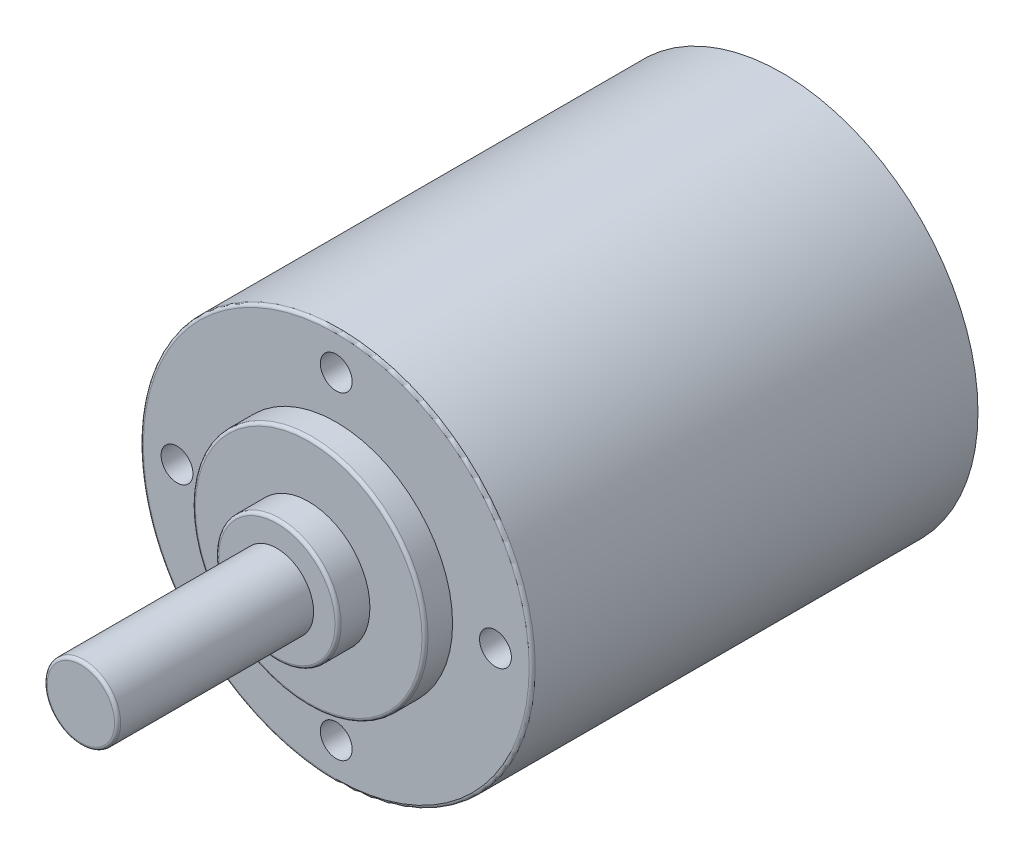
ISO-10303-21;
HEADER;
FILE_DESCRIPTION(('STEP AP214'),'2;1');
FILE_NAME('part.step','',(''),(''),'','','');
FILE_SCHEMA(('AUTOMOTIVE_DESIGN { 1 0 10303 214 1 1 1 1 }'));
ENDSEC;
DATA;
#1=APPLICATION_CONTEXT('core data for automotive mechanical design processes');
#2=APPLICATION_PROTOCOL_DEFINITION('international standard','automotive_design',2000,#1);
#3=PRODUCT_CONTEXT('',#1,'mechanical');
#4=PRODUCT('Part','Part','',(#3));
#5=PRODUCT_RELATED_PRODUCT_CATEGORY('part','',(#4));
#6=PRODUCT_DEFINITION_FORMATION('','',#4);
#7=PRODUCT_DEFINITION_CONTEXT('part definition',#1,'design');
#8=PRODUCT_DEFINITION('design','',#6,#7);
#9=PRODUCT_DEFINITION_SHAPE('','',#8);
#10=(LENGTH_UNIT() NAMED_UNIT(*) SI_UNIT(.MILLI.,.METRE.));
#11=(NAMED_UNIT(*) PLANE_ANGLE_UNIT() SI_UNIT($,.RADIAN.));
#12=(NAMED_UNIT(*) SI_UNIT($,.STERADIAN.) SOLID_ANGLE_UNIT());
#13=UNCERTAINTY_MEASURE_WITH_UNIT(LENGTH_MEASURE(1.E-05),#10,'distance_accuracy_value','');
#14=(GEOMETRIC_REPRESENTATION_CONTEXT(3) GLOBAL_UNCERTAINTY_ASSIGNED_CONTEXT((#13)) GLOBAL_UNIT_ASSIGNED_CONTEXT((#10,
#11,#12)) REPRESENTATION_CONTEXT('',''));
#15=CARTESIAN_POINT('',(0.,0.,0.));
#16=DIRECTION('',(0.,0.,1.));
#17=DIRECTION('',(1.,0.,0.));
#18=AXIS2_PLACEMENT_3D('',#15,#16,#17);
#19=CARTESIAN_POINT('',(0.,0.,41.25));
#20=DIRECTION('',(0.,0.,1.));
#21=DIRECTION('',(1.,0.,0.));
#22=AXIS2_PLACEMENT_3D('',#19,#20,#21);
#23=PLANE('',#22);
#24=CARTESIAN_POINT('',(0.,0.,41.25));
#25=DIRECTION('',(0.,0.,1.));
#26=DIRECTION('',(1.,0.,0.));
#27=AXIS2_PLACEMENT_3D('',#24,#25,#26);
#28=CIRCLE('',#27,4.75);
#29=CARTESIAN_POINT('',(4.75,0.,41.25));
#30=VERTEX_POINT('',#29);
#31=EDGE_CURVE('E38',#30,#30,#28,.T.);
#32=ORIENTED_EDGE('',*,*,#31,.T.);
#33=EDGE_LOOP('',(#32));
#34=FACE_BOUND('',#33,.T.);
#35=CARTESIAN_POINT('',(0.,0.,41.25));
#36=DIRECTION('',(0.,0.,1.));
#37=DIRECTION('',(1.,0.,0.));
#38=AXIS2_PLACEMENT_3D('',#35,#36,#37);
#39=CIRCLE('',#38,3.);
#40=CARTESIAN_POINT('',(3.,0.,41.25));
#41=VERTEX_POINT('',#40);
#42=EDGE_CURVE('E72',#41,#41,#39,.T.);
#43=ORIENTED_EDGE('',*,*,#42,.F.);
#44=EDGE_LOOP('',(#43));
#45=FACE_BOUND('',#44,.T.);
#46=ADVANCED_FACE('F31',(#34,#45),#23,.T.);
#47=CARTESIAN_POINT('',(0.,0.,38.65));
#48=DIRECTION('',(0.,0.,1.));
#49=DIRECTION('',(1.,0.,0.));
#50=AXIS2_PLACEMENT_3D('',#47,#48,#49);
#51=PLANE('',#50);
#52=CARTESIAN_POINT('',(0.,0.,38.65));
#53=DIRECTION('',(0.,0.,1.));
#54=DIRECTION('',(1.,0.,0.));
#55=AXIS2_PLACEMENT_3D('',#52,#53,#54);
#56=CIRCLE('',#55,9.25);
#57=CARTESIAN_POINT('',(9.25,0.,38.65));
#58=VERTEX_POINT('',#57);
#59=EDGE_CURVE('E54',#58,#58,#56,.T.);
#60=ORIENTED_EDGE('',*,*,#59,.T.);
#61=EDGE_LOOP('',(#60));
#62=FACE_BOUND('',#61,.T.);
#63=CARTESIAN_POINT('',(0.,0.,38.65));
#64=DIRECTION('',(0.,0.,1.));
#65=DIRECTION('',(1.,0.,0.));
#66=AXIS2_PLACEMENT_3D('',#63,#64,#65);
#67=CIRCLE('',#66,5.);
#68=CARTESIAN_POINT('',(5.,0.,38.65));
#69=VERTEX_POINT('',#68);
#70=EDGE_CURVE('E69',#69,#69,#67,.T.);
#71=ORIENTED_EDGE('',*,*,#70,.F.);
#72=EDGE_LOOP('',(#71));
#73=FACE_BOUND('',#72,.T.);
#74=ADVANCED_FACE('F130',(#62,#73),#51,.T.);
#75=CARTESIAN_POINT('',(0.,0.,36.4));
#76=DIRECTION('',(0.,0.,1.));
#77=DIRECTION('',(1.,0.,0.));
#78=AXIS2_PLACEMENT_3D('',#75,#76,#77);
#79=PLANE('',#78);
#80=CARTESIAN_POINT('',(0.,-13.,36.4));
#81=DIRECTION('',(0.,0.,1.));
#82=DIRECTION('',(1.,0.,0.));
#83=AXIS2_PLACEMENT_3D('',#80,#81,#82);
#84=CIRCLE('',#83,1.3);
#85=CARTESIAN_POINT('',(1.3,-13.,36.4));
#86=VERTEX_POINT('',#85);
#87=EDGE_CURVE('E94',#86,#86,#84,.T.);
#88=ORIENTED_EDGE('',*,*,#87,.F.);
#89=EDGE_LOOP('',(#88));
#90=FACE_BOUND('',#89,.T.);
#91=CARTESIAN_POINT('',(13.,0.,36.4));
#92=DIRECTION('',(0.,0.,1.));
#93=DIRECTION('',(1.,0.,0.));
#94=AXIS2_PLACEMENT_3D('',#91,#92,#93);
#95=CIRCLE('',#94,1.3);
#96=CARTESIAN_POINT('',(14.3,0.,36.4));
#97=VERTEX_POINT('',#96);
#98=EDGE_CURVE('E88',#97,#97,#95,.T.);
#99=ORIENTED_EDGE('',*,*,#98,.F.);
#100=EDGE_LOOP('',(#99));
#101=FACE_BOUND('',#100,.T.);
#102=CARTESIAN_POINT('',(-13.,0.,36.4));
#103=DIRECTION('',(0.,0.,1.));
#104=DIRECTION('',(1.,0.,0.));
#105=AXIS2_PLACEMENT_3D('',#102,#103,#104);
#106=CIRCLE('',#105,1.3);
#107=CARTESIAN_POINT('',(-11.7,0.,36.4));
#108=VERTEX_POINT('',#107);
#109=EDGE_CURVE('E82',#108,#108,#106,.T.);
#110=ORIENTED_EDGE('',*,*,#109,.F.);
#111=EDGE_LOOP('',(#110));
#112=FACE_BOUND('',#111,.T.);
#113=CARTESIAN_POINT('',(0.,13.,36.4));
#114=DIRECTION('',(0.,0.,1.));
#115=DIRECTION('',(1.,0.,0.));
#116=AXIS2_PLACEMENT_3D('',#113,#114,#115);
#117=CIRCLE('',#116,1.3);
#118=CARTESIAN_POINT('',(1.3,13.,36.4));
#119=VERTEX_POINT('',#118);
#120=EDGE_CURVE('E76',#119,#119,#117,.T.);
#121=ORIENTED_EDGE('',*,*,#120,.F.);
#122=EDGE_LOOP('',(#121));
#123=FACE_BOUND('',#122,.T.);
#124=CARTESIAN_POINT('',(0.,0.,36.4));
#125=DIRECTION('',(0.,0.,1.));
#126=DIRECTION('',(1.,0.,0.));
#127=AXIS2_PLACEMENT_3D('',#124,#125,#126);
#128=CIRCLE('',#127,15.75);
#129=CARTESIAN_POINT('',(15.75,0.,36.4));
#130=VERTEX_POINT('',#129);
#131=EDGE_CURVE('E60',#130,#130,#128,.T.);
#132=ORIENTED_EDGE('',*,*,#131,.T.);
#133=EDGE_LOOP('',(#132));
#134=FACE_BOUND('',#133,.T.);
#135=CARTESIAN_POINT('',(0.,0.,36.4));
#136=DIRECTION('',(0.,0.,1.));
#137=DIRECTION('',(1.,0.,0.));
#138=AXIS2_PLACEMENT_3D('',#135,#136,#137);
#139=CIRCLE('',#138,9.5);
#140=CARTESIAN_POINT('',(9.5,0.,36.4));
#141=VERTEX_POINT('',#140);
#142=EDGE_CURVE('E66',#141,#141,#139,.T.);
#143=ORIENTED_EDGE('',*,*,#142,.F.);
#144=EDGE_LOOP('',(#143));
#145=FACE_BOUND('',#144,.T.);
#146=ADVANCED_FACE('F124',(#90,#101,#112,#123,#134,#145),#79,.T.);
#147=CARTESIAN_POINT('',(0.,0.,36.4));
#148=DIRECTION('',(0.,0.,-1.));
#149=DIRECTION('',(-1.,0.,0.));
#150=AXIS2_PLACEMENT_3D('',#147,#148,#149);
#151=CYLINDRICAL_SURFACE('',#150,16.);
#152=CARTESIAN_POINT('',(0.,0.,36.15));
#153=DIRECTION('',(0.,0.,1.));
#154=DIRECTION('',(1.,0.,0.));
#155=AXIS2_PLACEMENT_3D('',#152,#153,#154);
#156=CIRCLE('',#155,16.);
#157=CARTESIAN_POINT('',(16.,0.,36.15));
#158=VERTEX_POINT('',#157);
#159=EDGE_CURVE('E57',#158,#158,#156,.F.);
#160=ORIENTED_EDGE('',*,*,#159,.T.);
#161=EDGE_LOOP('',(#160));
#162=FACE_BOUND('',#161,.T.);
#163=CARTESIAN_POINT('',(0.,0.,0.));
#164=DIRECTION('',(0.,0.,1.));
#165=DIRECTION('',(1.,0.,0.));
#166=AXIS2_PLACEMENT_3D('',#163,#164,#165);
#167=CIRCLE('',#166,16.);
#168=CARTESIAN_POINT('',(16.,0.,0.));
#169=VERTEX_POINT('',#168);
#170=EDGE_CURVE('E63',#169,#169,#167,.T.);
#171=ORIENTED_EDGE('',*,*,#170,.T.);
#172=EDGE_LOOP('',(#171));
#173=FACE_BOUND('',#172,.T.);
#174=ADVANCED_FACE('F119',(#162,#173),#151,.T.);
#175=CARTESIAN_POINT('',(0.,0.,0.));
#176=DIRECTION('',(0.,0.,1.));
#177=DIRECTION('',(1.,0.,0.));
#178=AXIS2_PLACEMENT_3D('',#175,#176,#177);
#179=PLANE('',#178);
#180=CARTESIAN_POINT('',(0.,0.,0.));
#181=DIRECTION('',(0.,0.,-1.));
#182=DIRECTION('',(-1.,0.,0.));
#183=AXIS2_PLACEMENT_3D('',#180,#181,#182);
#184=CIRCLE('',#183,2.);
#185=CARTESIAN_POINT('',(-2.,0.,0.));
#186=VERTEX_POINT('',#185);
#187=EDGE_CURVE('E100',#186,#186,#184,.T.);
#188=ORIENTED_EDGE('',*,*,#187,.F.);
#189=EDGE_LOOP('',(#188));
#190=FACE_BOUND('',#189,.T.);
#191=ORIENTED_EDGE('',*,*,#170,.F.);
#192=EDGE_LOOP('',(#191));
#193=FACE_BOUND('',#192,.T.);
#194=ADVANCED_FACE('F115',(#190,#193),#179,.F.);
#195=CARTESIAN_POINT('',(0.,0.,38.65));
#196=DIRECTION('',(0.,0.,-1.));
#197=DIRECTION('',(-1.,0.,0.));
#198=AXIS2_PLACEMENT_3D('',#195,#196,#197);
#199=CYLINDRICAL_SURFACE('',#198,9.5);
#200=CARTESIAN_POINT('',(0.,0.,38.4));
#201=DIRECTION('',(0.,0.,1.));
#202=DIRECTION('',(1.,0.,0.));
#203=AXIS2_PLACEMENT_3D('',#200,#201,#202);
#204=CIRCLE('',#203,9.5);
#205=CARTESIAN_POINT('',(9.5,0.,38.4));
#206=VERTEX_POINT('',#205);
#207=EDGE_CURVE('E51',#206,#206,#204,.F.);
#208=ORIENTED_EDGE('',*,*,#207,.T.);
#209=EDGE_LOOP('',(#208));
#210=FACE_BOUND('',#209,.T.);
#211=ORIENTED_EDGE('',*,*,#142,.T.);
#212=EDGE_LOOP('',(#211));
#213=FACE_BOUND('',#212,.T.);
#214=ADVANCED_FACE('F118',(#210,#213),#199,.T.);
#215=CARTESIAN_POINT('',(0.,0.,41.25));
#216=DIRECTION('',(0.,0.,-1.));
#217=DIRECTION('',(-1.,0.,0.));
#218=AXIS2_PLACEMENT_3D('',#215,#216,#217);
#219=CYLINDRICAL_SURFACE('',#218,5.);
#220=CARTESIAN_POINT('',(0.,0.,41.));
#221=DIRECTION('',(0.,0.,1.));
#222=DIRECTION('',(1.,0.,0.));
#223=AXIS2_PLACEMENT_3D('',#220,#221,#222);
#224=CIRCLE('',#223,5.);
#225=CARTESIAN_POINT('',(5.,0.,41.));
#226=VERTEX_POINT('',#225);
#227=EDGE_CURVE('E10',#226,#226,#224,.F.);
#228=ORIENTED_EDGE('',*,*,#227,.T.);
#229=EDGE_LOOP('',(#228));
#230=FACE_BOUND('',#229,.T.);
#231=ORIENTED_EDGE('',*,*,#70,.T.);
#232=EDGE_LOOP('',(#231));
#233=FACE_BOUND('',#232,.T.);
#234=ADVANCED_FACE('F146',(#230,#233),#219,.T.);
#235=CARTESIAN_POINT('',(0.,0.,57.25));
#236=DIRECTION('',(0.,0.,-1.));
#237=DIRECTION('',(-1.,0.,0.));
#238=AXIS2_PLACEMENT_3D('',#235,#236,#237);
#239=CYLINDRICAL_SURFACE('',#238,3.);
#240=CARTESIAN_POINT('',(0.,0.,57.));
#241=DIRECTION('',(0.,0.,1.));
#242=DIRECTION('',(1.,0.,0.));
#243=AXIS2_PLACEMENT_3D('',#240,#241,#242);
#244=CIRCLE('',#243,3.);
#245=CARTESIAN_POINT('',(3.,0.,57.));
#246=VERTEX_POINT('',#245);
#247=EDGE_CURVE('E42',#246,#246,#244,.F.);
#248=ORIENTED_EDGE('',*,*,#247,.T.);
#249=EDGE_LOOP('',(#248));
#250=FACE_BOUND('',#249,.T.);
#251=ORIENTED_EDGE('',*,*,#42,.T.);
#252=EDGE_LOOP('',(#251));
#253=FACE_BOUND('',#252,.T.);
#254=ADVANCED_FACE('F144',(#250,#253),#239,.T.);
#255=CARTESIAN_POINT('',(0.,0.,57.25));
#256=DIRECTION('',(0.,0.,1.));
#257=DIRECTION('',(1.,0.,0.));
#258=AXIS2_PLACEMENT_3D('',#255,#256,#257);
#259=PLANE('',#258);
#260=CARTESIAN_POINT('',(0.,0.,57.25));
#261=DIRECTION('',(0.,0.,1.));
#262=DIRECTION('',(1.,0.,0.));
#263=AXIS2_PLACEMENT_3D('',#260,#261,#262);
#264=CIRCLE('',#263,2.75);
#265=CARTESIAN_POINT('',(2.75,0.,57.25));
#266=VERTEX_POINT('',#265);
#267=EDGE_CURVE('E46',#266,#266,#264,.T.);
#268=ORIENTED_EDGE('',*,*,#267,.T.);
#269=EDGE_LOOP('',(#268));
#270=FACE_BOUND('',#269,.T.);
#271=ADVANCED_FACE('F173',(#270),#259,.T.);
#272=CARTESIAN_POINT('',(0.,0.,36.15));
#273=DIRECTION('',(0.,0.,1.));
#274=DIRECTION('',(1.,0.,0.));
#275=AXIS2_PLACEMENT_3D('',#272,#273,#274);
#276=TOROIDAL_SURFACE('',#275,15.75,0.25);
#277=ORIENTED_EDGE('',*,*,#159,.F.);
#278=EDGE_LOOP('',(#277));
#279=FACE_BOUND('',#278,.T.);
#280=ORIENTED_EDGE('',*,*,#131,.F.);
#281=EDGE_LOOP('',(#280));
#282=FACE_BOUND('',#281,.T.);
#283=ADVANCED_FACE('F162',(#279,#282),#276,.T.);
#284=CARTESIAN_POINT('',(0.,0.,38.4));
#285=DIRECTION('',(0.,0.,1.));
#286=DIRECTION('',(1.,0.,0.));
#287=AXIS2_PLACEMENT_3D('',#284,#285,#286);
#288=TOROIDAL_SURFACE('',#287,9.25,0.25);
#289=ORIENTED_EDGE('',*,*,#207,.F.);
#290=EDGE_LOOP('',(#289));
#291=FACE_BOUND('',#290,.T.);
#292=ORIENTED_EDGE('',*,*,#59,.F.);
#293=EDGE_LOOP('',(#292));
#294=FACE_BOUND('',#293,.T.);
#295=ADVANCED_FACE('F158',(#291,#294),#288,.T.);
#296=CARTESIAN_POINT('',(0.,0.,57.));
#297=DIRECTION('',(0.,0.,1.));
#298=DIRECTION('',(1.,0.,0.));
#299=AXIS2_PLACEMENT_3D('',#296,#297,#298);
#300=TOROIDAL_SURFACE('',#299,2.75,0.25);
#301=ORIENTED_EDGE('',*,*,#247,.F.);
#302=EDGE_LOOP('',(#301));
#303=FACE_BOUND('',#302,.T.);
#304=ORIENTED_EDGE('',*,*,#267,.F.);
#305=EDGE_LOOP('',(#304));
#306=FACE_BOUND('',#305,.T.);
#307=ADVANCED_FACE('F161',(#303,#306),#300,.T.);
#308=CARTESIAN_POINT('',(0.,0.,41.));
#309=DIRECTION('',(0.,0.,1.));
#310=DIRECTION('',(1.,0.,0.));
#311=AXIS2_PLACEMENT_3D('',#308,#309,#310);
#312=TOROIDAL_SURFACE('',#311,4.75,0.25);
#313=ORIENTED_EDGE('',*,*,#227,.F.);
#314=EDGE_LOOP('',(#313));
#315=FACE_BOUND('',#314,.T.);
#316=ORIENTED_EDGE('',*,*,#31,.F.);
#317=EDGE_LOOP('',(#316));
#318=FACE_BOUND('',#317,.T.);
#319=ADVANCED_FACE('F33',(#315,#318),#312,.T.);
#320=CARTESIAN_POINT('',(0.,13.,29.4));
#321=DIRECTION('',(0.,0.,1.));
#322=DIRECTION('',(1.,0.,0.));
#323=AXIS2_PLACEMENT_3D('',#320,#321,#322);
#324=CYLINDRICAL_SURFACE('',#323,1.3);
#325=CARTESIAN_POINT('',(0.,13.,29.4));
#326=DIRECTION('',(0.,0.,1.));
#327=DIRECTION('',(1.,0.,0.));
#328=AXIS2_PLACEMENT_3D('',#325,#326,#327);
#329=CIRCLE('',#328,1.3);
#330=CARTESIAN_POINT('',(1.3,13.,29.4));
#331=VERTEX_POINT('',#330);
#332=EDGE_CURVE('E75',#331,#331,#329,.T.);
#333=ORIENTED_EDGE('',*,*,#332,.F.);
#334=EDGE_LOOP('',(#333));
#335=FACE_BOUND('',#334,.T.);
#336=ORIENTED_EDGE('',*,*,#120,.T.);
#337=EDGE_LOOP('',(#336));
#338=FACE_BOUND('',#337,.T.);
#339=ADVANCED_FACE('F188',(#335,#338),#324,.F.);
#340=CARTESIAN_POINT('',(0.,13.,29.4));
#341=DIRECTION('',(0.,0.,1.));
#342=DIRECTION('',(1.,0.,0.));
#343=AXIS2_PLACEMENT_3D('',#340,#341,#342);
#344=PLANE('',#343);
#345=ORIENTED_EDGE('',*,*,#332,.T.);
#346=EDGE_LOOP('',(#345));
#347=FACE_BOUND('',#346,.T.);
#348=ADVANCED_FACE('F191',(#347),#344,.T.);
#349=CARTESIAN_POINT('',(-13.,0.,29.4));
#350=DIRECTION('',(0.,0.,1.));
#351=DIRECTION('',(1.,0.,0.));
#352=AXIS2_PLACEMENT_3D('',#349,#350,#351);
#353=CYLINDRICAL_SURFACE('',#352,1.3);
#354=CARTESIAN_POINT('',(-13.,0.,29.4));
#355=DIRECTION('',(0.,0.,1.));
#356=DIRECTION('',(1.,0.,0.));
#357=AXIS2_PLACEMENT_3D('',#354,#355,#356);
#358=CIRCLE('',#357,1.3);
#359=CARTESIAN_POINT('',(-11.7,0.,29.4));
#360=VERTEX_POINT('',#359);
#361=EDGE_CURVE('E79',#360,#360,#358,.T.);
#362=ORIENTED_EDGE('',*,*,#361,.F.);
#363=EDGE_LOOP('',(#362));
#364=FACE_BOUND('',#363,.T.);
#365=ORIENTED_EDGE('',*,*,#109,.T.);
#366=EDGE_LOOP('',(#365));
#367=FACE_BOUND('',#366,.T.);
#368=ADVANCED_FACE('F195',(#364,#367),#353,.F.);
#369=CARTESIAN_POINT('',(-13.,0.,29.4));
#370=DIRECTION('',(0.,0.,1.));
#371=DIRECTION('',(1.,0.,0.));
#372=AXIS2_PLACEMENT_3D('',#369,#370,#371);
#373=PLANE('',#372);
#374=ORIENTED_EDGE('',*,*,#361,.T.);
#375=EDGE_LOOP('',(#374));
#376=FACE_BOUND('',#375,.T.);
#377=ADVANCED_FACE('F199',(#376),#373,.T.);
#378=CARTESIAN_POINT('',(13.,0.,29.4));
#379=DIRECTION('',(0.,0.,1.));
#380=DIRECTION('',(1.,0.,0.));
#381=AXIS2_PLACEMENT_3D('',#378,#379,#380);
#382=CYLINDRICAL_SURFACE('',#381,1.3);
#383=CARTESIAN_POINT('',(13.,0.,29.4));
#384=DIRECTION('',(0.,0.,1.));
#385=DIRECTION('',(1.,0.,0.));
#386=AXIS2_PLACEMENT_3D('',#383,#384,#385);
#387=CIRCLE('',#386,1.3);
#388=CARTESIAN_POINT('',(14.3,0.,29.4));
#389=VERTEX_POINT('',#388);
#390=EDGE_CURVE('E85',#389,#389,#387,.T.);
#391=ORIENTED_EDGE('',*,*,#390,.F.);
#392=EDGE_LOOP('',(#391));
#393=FACE_BOUND('',#392,.T.);
#394=ORIENTED_EDGE('',*,*,#98,.T.);
#395=EDGE_LOOP('',(#394));
#396=FACE_BOUND('',#395,.T.);
#397=ADVANCED_FACE('F203',(#393,#396),#382,.F.);
#398=CARTESIAN_POINT('',(13.,0.,29.4));
#399=DIRECTION('',(0.,0.,1.));
#400=DIRECTION('',(1.,0.,0.));
#401=AXIS2_PLACEMENT_3D('',#398,#399,#400);
#402=PLANE('',#401);
#403=ORIENTED_EDGE('',*,*,#390,.T.);
#404=EDGE_LOOP('',(#403));
#405=FACE_BOUND('',#404,.T.);
#406=ADVANCED_FACE('F207',(#405),#402,.T.);
#407=CARTESIAN_POINT('',(0.,-13.,29.4));
#408=DIRECTION('',(0.,0.,1.));
#409=DIRECTION('',(1.,0.,0.));
#410=AXIS2_PLACEMENT_3D('',#407,#408,#409);
#411=CYLINDRICAL_SURFACE('',#410,1.3);
#412=CARTESIAN_POINT('',(0.,-13.,29.4));
#413=DIRECTION('',(0.,0.,1.));
#414=DIRECTION('',(1.,0.,0.));
#415=AXIS2_PLACEMENT_3D('',#412,#413,#414);
#416=CIRCLE('',#415,1.3);
#417=CARTESIAN_POINT('',(1.3,-13.,29.4));
#418=VERTEX_POINT('',#417);
#419=EDGE_CURVE('E91',#418,#418,#416,.T.);
#420=ORIENTED_EDGE('',*,*,#419,.F.);
#421=EDGE_LOOP('',(#420));
#422=FACE_BOUND('',#421,.T.);
#423=ORIENTED_EDGE('',*,*,#87,.T.);
#424=EDGE_LOOP('',(#423));
#425=FACE_BOUND('',#424,.T.);
#426=ADVANCED_FACE('F211',(#422,#425),#411,.F.);
#427=CARTESIAN_POINT('',(0.,-13.,29.4));
#428=DIRECTION('',(0.,0.,1.));
#429=DIRECTION('',(1.,0.,0.));
#430=AXIS2_PLACEMENT_3D('',#427,#428,#429);
#431=PLANE('',#430);
#432=ORIENTED_EDGE('',*,*,#419,.T.);
#433=EDGE_LOOP('',(#432));
#434=FACE_BOUND('',#433,.T.);
#435=ADVANCED_FACE('F111',(#434),#431,.T.);
#436=CARTESIAN_POINT('',(0.,0.,13.8));
#437=DIRECTION('',(0.,0.,-1.));
#438=DIRECTION('',(-1.,0.,0.));
#439=AXIS2_PLACEMENT_3D('',#436,#437,#438);
#440=CYLINDRICAL_SURFACE('',#439,2.);
#441=CARTESIAN_POINT('',(0.,0.,13.8));
#442=DIRECTION('',(0.,0.,-1.));
#443=DIRECTION('',(-1.,0.,0.));
#444=AXIS2_PLACEMENT_3D('',#441,#442,#443);
#445=CIRCLE('',#444,2.);
#446=CARTESIAN_POINT('',(-2.,0.,13.8));
#447=VERTEX_POINT('',#446);
#448=EDGE_CURVE('E97',#447,#447,#445,.T.);
#449=CARTESIAN_POINT('',(-2.,0.,13.8));
#450=CARTESIAN_POINT('',(-2.,0.,13.65625));
#451=CARTESIAN_POINT('',(-2.,0.,13.5125));
#452=CARTESIAN_POINT('',(-2.,0.,13.225));
#453=CARTESIAN_POINT('',(-2.,0.,13.08125));
#454=CARTESIAN_POINT('',(-2.,0.,12.79375));
#455=CARTESIAN_POINT('',(-2.,0.,12.65));
#456=CARTESIAN_POINT('',(-2.,0.,12.3625));
#457=CARTESIAN_POINT('',(-2.,0.,12.21875));
#458=CARTESIAN_POINT('',(-2.,0.,11.93125));
#459=CARTESIAN_POINT('',(-2.,0.,11.7875));
#460=CARTESIAN_POINT('',(-2.,0.,11.5));
#461=CARTESIAN_POINT('',(-2.,0.,11.35625));
#462=CARTESIAN_POINT('',(-2.,0.,11.06875));
#463=CARTESIAN_POINT('',(-2.,0.,10.925));
#464=CARTESIAN_POINT('',(-2.,0.,10.6375));
#465=CARTESIAN_POINT('',(-2.,0.,10.49375));
#466=CARTESIAN_POINT('',(-2.,0.,10.20625));
#467=CARTESIAN_POINT('',(-2.,0.,10.0625));
#468=CARTESIAN_POINT('',(-2.,0.,9.775));
#469=CARTESIAN_POINT('',(-2.,0.,9.63125));
#470=CARTESIAN_POINT('',(-2.,0.,9.34375));
#471=CARTESIAN_POINT('',(-2.,0.,9.2));
#472=CARTESIAN_POINT('',(-2.,0.,8.9125));
#473=CARTESIAN_POINT('',(-2.,0.,8.76875));
#474=CARTESIAN_POINT('',(-2.,0.,8.48125));
#475=CARTESIAN_POINT('',(-2.,0.,8.3375));
#476=CARTESIAN_POINT('',(-2.,0.,8.05));
#477=CARTESIAN_POINT('',(-2.,0.,7.90625));
#478=CARTESIAN_POINT('',(-2.,0.,7.61875));
#479=CARTESIAN_POINT('',(-2.,0.,7.475));
#480=CARTESIAN_POINT('',(-2.,0.,7.1875));
#481=CARTESIAN_POINT('',(-2.,0.,7.04375));
#482=CARTESIAN_POINT('',(-2.,0.,6.75625));
#483=CARTESIAN_POINT('',(-2.,0.,6.6125));
#484=CARTESIAN_POINT('',(-2.,0.,6.325));
#485=CARTESIAN_POINT('',(-2.,0.,6.18125));
#486=CARTESIAN_POINT('',(-2.,0.,5.89375));
#487=CARTESIAN_POINT('',(-2.,0.,5.75));
#488=CARTESIAN_POINT('',(-2.,0.,5.4625));
#489=CARTESIAN_POINT('',(-2.,0.,5.31875));
#490=CARTESIAN_POINT('',(-2.,0.,5.03125));
#491=CARTESIAN_POINT('',(-2.,0.,4.8875));
#492=CARTESIAN_POINT('',(-2.,0.,4.6));
#493=CARTESIAN_POINT('',(-2.,0.,4.45625));
#494=CARTESIAN_POINT('',(-2.,0.,4.16875));
#495=CARTESIAN_POINT('',(-2.,0.,4.025));
#496=CARTESIAN_POINT('',(-2.,0.,3.7375));
#497=CARTESIAN_POINT('',(-2.,0.,3.59375));
#498=CARTESIAN_POINT('',(-2.,0.,3.30625));
#499=CARTESIAN_POINT('',(-2.,0.,3.1625));
#500=CARTESIAN_POINT('',(-2.,0.,2.875));
#501=CARTESIAN_POINT('',(-2.,0.,2.73125));
#502=CARTESIAN_POINT('',(-2.,0.,2.44375));
#503=CARTESIAN_POINT('',(-2.,0.,2.3));
#504=CARTESIAN_POINT('',(-2.,0.,2.0125));
#505=CARTESIAN_POINT('',(-2.,0.,1.86875));
#506=CARTESIAN_POINT('',(-2.,0.,1.58125));
#507=CARTESIAN_POINT('',(-2.,0.,1.4375));
#508=CARTESIAN_POINT('',(-2.,0.,1.15));
#509=CARTESIAN_POINT('',(-2.,0.,1.00625));
#510=CARTESIAN_POINT('',(-2.,0.,0.71875));
#511=CARTESIAN_POINT('',(-2.,0.,0.575));
#512=CARTESIAN_POINT('',(-2.,0.,0.2875));
#513=CARTESIAN_POINT('',(-2.,0.,0.14375));
#514=CARTESIAN_POINT('',(-2.,0.,0.));
#515=B_SPLINE_CURVE_WITH_KNOTS('',3,(#449,#450,#451,#452,#453,#454,#455,#456,#457,#458,#459,
#460,#461,#462,#463,#464,#465,#466,#467,#468,#469,#470,#471,#472,#473,#474,#475,#476,#477,#478,
#479,#480,#481,#482,#483,#484,#485,#486,#487,#488,#489,#490,#491,#492,#493,#494,#495,#496,#497,
#498,#499,#500,#501,#502,#503,#504,#505,#506,#507,#508,#509,#510,#511,#512,#513,#514),
.UNSPECIFIED.,.F.,.F.,(4,2,2,2,2,2,2,2,2,2,2,2,2,2,2,2,2,2,2,2,2,2,2,2,2,2,2,2,2,2,2,2,4),(0.,
0.431249999999999,0.862499999999999,1.29375,1.725,2.15625,2.5875,3.01875,3.45,3.88125,4.3125,
4.74375,5.175,5.60625,6.0375,6.46875,6.9,7.33125,7.7625,8.19375,8.625,9.05625,9.4875,9.91875,
10.35,10.78125,11.2125,11.64375,12.075,12.50625,12.9375,13.36875,13.8),.UNSPECIFIED.);
#516=EDGE_CURVE('BSEAM108',#447,#186,#515,.T.);
#517=ORIENTED_EDGE('',*,*,#448,.F.);
#518=ORIENTED_EDGE('',*,*,#187,.T.);
#519=ORIENTED_EDGE('',*,*,#516,.T.);
#520=ORIENTED_EDGE('',*,*,#516,.F.);
#521=EDGE_LOOP('',(#517,#519,#518,#520));
#522=FACE_BOUND('',#521,.T.);
#523=ADVANCED_FACE('F108',(#522),#440,.F.);
#524=CARTESIAN_POINT('',(0.,0.,13.8));
#525=DIRECTION('',(0.,0.,-1.));
#526=DIRECTION('',(-1.,0.,0.));
#527=AXIS2_PLACEMENT_3D('',#524,#525,#526);
#528=PLANE('',#527);
#529=ORIENTED_EDGE('',*,*,#448,.T.);
#530=EDGE_LOOP('',(#529));
#531=FACE_BOUND('',#530,.T.);
#532=ADVANCED_FACE('F106',(#531),#528,.T.);
#533=CLOSED_SHELL('',(#46,#74,#146,#174,#194,#214,#234,#254,#271,#283,#295,#307,#319,#339,#348,
#368,#377,#397,#406,#426,#435,#523,#532));
#534=MANIFOLD_SOLID_BREP('B2',#533);
#535=ADVANCED_BREP_SHAPE_REPRESENTATION('',(#18,#534),#14);
#536=SHAPE_DEFINITION_REPRESENTATION(#9,#535);
ENDSEC;
END-ISO-10303-21;
